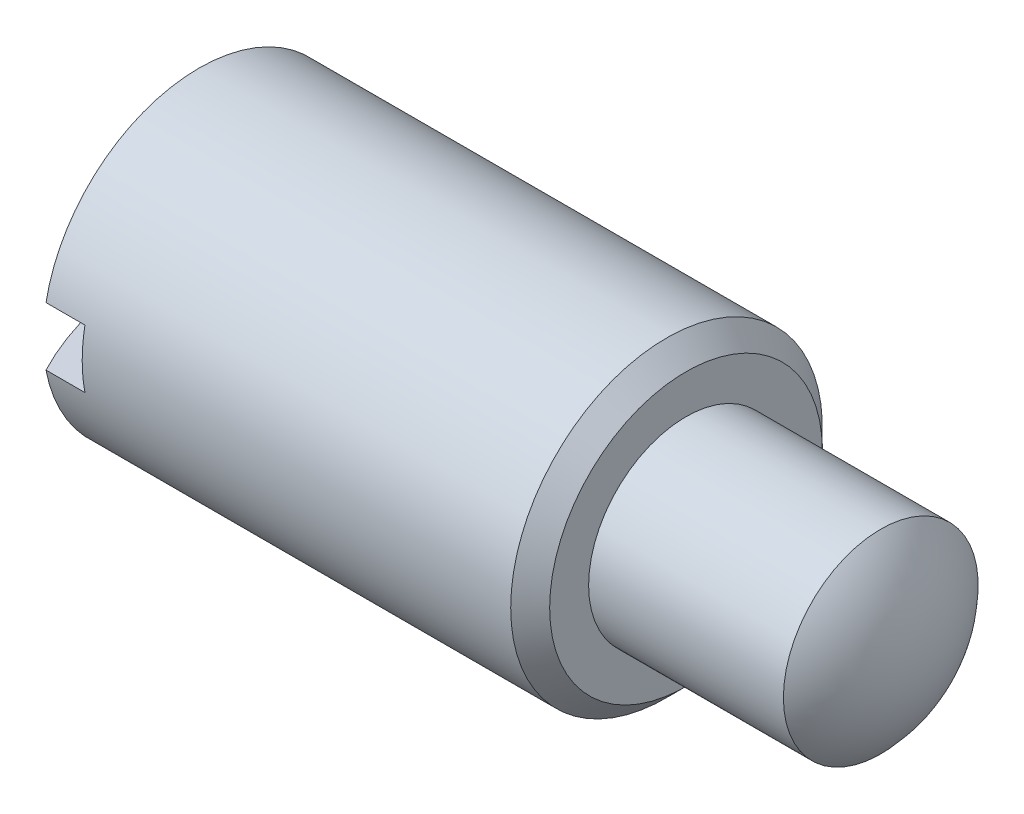
ISO-10303-21;
HEADER;
FILE_DESCRIPTION(('STEP AP214'),'2;1');
FILE_NAME('part.step','',(''),(''),'','','');
FILE_SCHEMA(('AUTOMOTIVE_DESIGN { 1 0 10303 214 1 1 1 1 }'));
ENDSEC;
DATA;
#1=APPLICATION_CONTEXT('core data for automotive mechanical design processes');
#2=APPLICATION_PROTOCOL_DEFINITION('international standard','automotive_design',2000,#1);
#3=PRODUCT_CONTEXT('',#1,'mechanical');
#4=PRODUCT('Part','Part','',(#3));
#5=PRODUCT_RELATED_PRODUCT_CATEGORY('part','',(#4));
#6=PRODUCT_DEFINITION_FORMATION('','',#4);
#7=PRODUCT_DEFINITION_CONTEXT('part definition',#1,'design');
#8=PRODUCT_DEFINITION('design','',#6,#7);
#9=PRODUCT_DEFINITION_SHAPE('','',#8);
#10=(LENGTH_UNIT() NAMED_UNIT(*) SI_UNIT(.MILLI.,.METRE.));
#11=(NAMED_UNIT(*) PLANE_ANGLE_UNIT() SI_UNIT($,.RADIAN.));
#12=(NAMED_UNIT(*) SI_UNIT($,.STERADIAN.) SOLID_ANGLE_UNIT());
#13=UNCERTAINTY_MEASURE_WITH_UNIT(LENGTH_MEASURE(1.E-05),#10,'distance_accuracy_value','');
#14=(GEOMETRIC_REPRESENTATION_CONTEXT(3) GLOBAL_UNCERTAINTY_ASSIGNED_CONTEXT((#13)) GLOBAL_UNIT_ASSIGNED_CONTEXT((#10,
#11,#12)) REPRESENTATION_CONTEXT('',''));
#15=CARTESIAN_POINT('',(0.,0.,0.));
#16=DIRECTION('',(0.,0.,1.));
#17=DIRECTION('',(1.,0.,0.));
#18=AXIS2_PLACEMENT_3D('',#15,#16,#17);
#19=CARTESIAN_POINT('',(7.5,0.,0.));
#20=DIRECTION('',(0.,0.,1.));
#21=DIRECTION('',(1.,0.,0.));
#22=AXIS2_PLACEMENT_3D('',#19,#20,#21);
#23=SPHERICAL_SURFACE('',#22,8.5);
#24=CARTESIAN_POINT('',(0.,0.,0.));
#25=DIRECTION('',(-1.,0.,0.));
#26=DIRECTION('',(0.,0.,1.));
#27=AXIS2_PLACEMENT_3D('',#24,#25,#26);
#28=CIRCLE('',#27,4.);
#29=CARTESIAN_POINT('',(0.,0.75,3.92905841137543));
#30=VERTEX_POINT('',#29);
#31=CARTESIAN_POINT('',(0.,0.75,-3.92905841137543));
#32=VERTEX_POINT('',#31);
#33=EDGE_CURVE('E94',#30,#32,#28,.T.);
#34=ORIENTED_EDGE('',*,*,#33,.T.);
#35=CARTESIAN_POINT('',(7.5,0.75,0.));
#36=DIRECTION('',(0.,-1.,0.));
#37=DIRECTION('',(0.,0.,-1.));
#38=AXIS2_PLACEMENT_3D('',#35,#36,#37);
#39=CIRCLE('',#38,8.46684711093805);
#40=EDGE_CURVE('E111',#32,#30,#39,.F.);
#41=ORIENTED_EDGE('',*,*,#40,.T.);
#42=EDGE_LOOP('',(#34,#41));
#43=FACE_BOUND('',#42,.T.);
#44=ADVANCED_FACE('F32',(#43),#23,.T.);
#45=CARTESIAN_POINT('',(0.,0.,0.));
#46=DIRECTION('',(-1.,0.,0.));
#47=DIRECTION('',(0.,0.,1.));
#48=AXIS2_PLACEMENT_3D('',#45,#46,#47);
#49=CYLINDRICAL_SURFACE('',#48,4.);
#50=CARTESIAN_POINT('',(12.,0.,0.));
#51=DIRECTION('',(-1.,0.,0.));
#52=DIRECTION('',(0.,0.,1.));
#53=AXIS2_PLACEMENT_3D('',#50,#51,#52);
#54=CIRCLE('',#53,4.);
#55=CARTESIAN_POINT('',(12.,0.,4.));
#56=VERTEX_POINT('',#55);
#57=EDGE_CURVE('E99',#56,#56,#54,.T.);
#58=ORIENTED_EDGE('',*,*,#57,.T.);
#59=EDGE_LOOP('',(#58));
#60=FACE_BOUND('',#59,.T.);
#61=DIRECTION('',(-1.,0.,0.));
#62=VECTOR('',#61,1.);
#63=CARTESIAN_POINT('',(0.,0.75,3.92905841137543));
#64=LINE('',#63,#62);
#65=CARTESIAN_POINT('',(1.,0.749999999999999,3.92905841137543));
#66=VERTEX_POINT('',#65);
#67=EDGE_CURVE('E11',#66,#30,#64,.T.);
#68=ORIENTED_EDGE('',*,*,#67,.F.);
#69=CARTESIAN_POINT('',(1.,0.,0.));
#70=DIRECTION('',(1.,0.,0.));
#71=DIRECTION('',(0.,0.,-1.));
#72=AXIS2_PLACEMENT_3D('',#69,#70,#71);
#73=CIRCLE('',#72,4.);
#74=CARTESIAN_POINT('',(1.,-0.75,3.92905841137543));
#75=VERTEX_POINT('',#74);
#76=EDGE_CURVE('E40',#66,#75,#73,.T.);
#77=ORIENTED_EDGE('',*,*,#76,.T.);
#78=DIRECTION('',(-1.,0.,0.));
#79=VECTOR('',#78,1.);
#80=CARTESIAN_POINT('',(0.,-0.75,3.92905841137543));
#81=LINE('',#80,#79);
#82=CARTESIAN_POINT('',(0.,-0.75,3.92905841137543));
#83=VERTEX_POINT('',#82);
#84=EDGE_CURVE('E70',#75,#83,#81,.T.);
#85=ORIENTED_EDGE('',*,*,#84,.T.);
#86=CARTESIAN_POINT('',(0.,-0.75,-3.92905841137543));
#87=VERTEX_POINT('',#86);
#88=EDGE_CURVE('E96',#87,#83,#28,.T.);
#89=ORIENTED_EDGE('',*,*,#88,.F.);
#90=DIRECTION('',(-1.,0.,0.));
#91=VECTOR('',#90,1.);
#92=CARTESIAN_POINT('',(0.,-0.75,-3.92905841137543));
#93=LINE('',#92,#91);
#94=CARTESIAN_POINT('',(1.,-0.75,-3.92905841137543));
#95=VERTEX_POINT('',#94);
#96=EDGE_CURVE('E92',#87,#95,#93,.F.);
#97=ORIENTED_EDGE('',*,*,#96,.T.);
#98=CARTESIAN_POINT('',(1.,0.75,-3.92905841137543));
#99=VERTEX_POINT('',#98);
#100=EDGE_CURVE('E83',#95,#99,#73,.T.);
#101=ORIENTED_EDGE('',*,*,#100,.T.);
#102=DIRECTION('',(-1.,0.,0.));
#103=VECTOR('',#102,1.);
#104=CARTESIAN_POINT('',(0.,0.75,-3.92905841137543));
#105=LINE('',#104,#103);
#106=EDGE_CURVE('E78',#32,#99,#105,.F.);
#107=ORIENTED_EDGE('',*,*,#106,.F.);
#108=ORIENTED_EDGE('',*,*,#33,.F.);
#109=EDGE_LOOP('',(#68,#77,#85,#89,#97,#101,#107,#108));
#110=FACE_BOUND('',#109,.T.);
#111=ADVANCED_FACE('F87',(#60,#110),#49,.T.);
#112=CARTESIAN_POINT('',(7.5,-0.75,0.));
#113=DIRECTION('',(0.,-1.,0.));
#114=DIRECTION('',(0.,0.,-1.));
#115=AXIS2_PLACEMENT_3D('',#112,#113,#114);
#116=CIRCLE('',#115,8.46684711093805);
#117=EDGE_CURVE('E73',#87,#83,#116,.F.);
#118=ORIENTED_EDGE('',*,*,#117,.F.);
#119=ORIENTED_EDGE('',*,*,#88,.T.);
#120=EDGE_LOOP('',(#118,#119));
#121=FACE_BOUND('',#120,.T.);
#122=ADVANCED_FACE('F34',(#121),#23,.T.);
#123=CARTESIAN_POINT('',(12.5,0.,0.));
#124=DIRECTION('',(-1.,0.,0.));
#125=DIRECTION('',(0.,0.,1.));
#126=AXIS2_PLACEMENT_3D('',#123,#124,#125);
#127=CONICAL_SURFACE('',#126,3.5,0.785398163397444);
#128=ORIENTED_EDGE('',*,*,#57,.F.);
#129=EDGE_LOOP('',(#128));
#130=FACE_BOUND('',#129,.T.);
#131=CARTESIAN_POINT('',(12.5,0.,0.));
#132=DIRECTION('',(-1.,0.,0.));
#133=DIRECTION('',(0.,0.,1.));
#134=AXIS2_PLACEMENT_3D('',#131,#132,#133);
#135=CIRCLE('',#134,3.5);
#136=CARTESIAN_POINT('',(12.5,0.,3.5));
#137=VERTEX_POINT('',#136);
#138=EDGE_CURVE('E102',#137,#137,#135,.T.);
#139=ORIENTED_EDGE('',*,*,#138,.T.);
#140=EDGE_LOOP('',(#139));
#141=FACE_BOUND('',#140,.T.);
#142=ADVANCED_FACE('F123',(#130,#141),#127,.T.);
#143=CARTESIAN_POINT('',(12.5,3.5,0.));
#144=DIRECTION('',(-1.,0.,0.));
#145=DIRECTION('',(0.,0.,1.));
#146=AXIS2_PLACEMENT_3D('',#143,#144,#145);
#147=PLANE('',#146);
#148=ORIENTED_EDGE('',*,*,#138,.F.);
#149=EDGE_LOOP('',(#148));
#150=FACE_BOUND('',#149,.T.);
#151=CARTESIAN_POINT('',(12.5,0.,0.));
#152=DIRECTION('',(-1.,0.,0.));
#153=DIRECTION('',(0.,0.,1.));
#154=AXIS2_PLACEMENT_3D('',#151,#152,#153);
#155=CIRCLE('',#154,2.5);
#156=CARTESIAN_POINT('',(12.5,0.,2.5));
#157=VERTEX_POINT('',#156);
#158=EDGE_CURVE('E105',#157,#157,#155,.T.);
#159=ORIENTED_EDGE('',*,*,#158,.T.);
#160=EDGE_LOOP('',(#159));
#161=FACE_BOUND('',#160,.T.);
#162=ADVANCED_FACE('F128',(#150,#161),#147,.F.);
#163=CARTESIAN_POINT('',(0.,0.,0.));
#164=DIRECTION('',(-1.,0.,0.));
#165=DIRECTION('',(0.,0.,1.));
#166=AXIS2_PLACEMENT_3D('',#163,#164,#165);
#167=CYLINDRICAL_SURFACE('',#166,2.5);
#168=ORIENTED_EDGE('',*,*,#158,.F.);
#169=EDGE_LOOP('',(#168));
#170=FACE_BOUND('',#169,.T.);
#171=CARTESIAN_POINT('',(17.5,0.,0.));
#172=DIRECTION('',(-1.,0.,0.));
#173=DIRECTION('',(0.,0.,1.));
#174=AXIS2_PLACEMENT_3D('',#171,#172,#173);
#175=CIRCLE('',#174,2.5);
#176=CARTESIAN_POINT('',(17.5,0.,2.5));
#177=VERTEX_POINT('',#176);
#178=EDGE_CURVE('E108',#177,#177,#175,.T.);
#179=ORIENTED_EDGE('',*,*,#178,.T.);
#180=EDGE_LOOP('',(#179));
#181=FACE_BOUND('',#180,.T.);
#182=ADVANCED_FACE('F134',(#170,#181),#167,.T.);
#183=CARTESIAN_POINT('',(14.875,0.,0.));
#184=DIRECTION('',(0.,0.,1.));
#185=DIRECTION('',(1.,0.,0.));
#186=AXIS2_PLACEMENT_3D('',#183,#184,#185);
#187=SPHERICAL_SURFACE('',#186,3.625);
#188=CARTESIAN_POINT('',(14.875,0.,0.));
#189=DIRECTION('',(-1.,0.,0.));
#190=DIRECTION('',(0.,0.,1.));
#191=AXIS2_PLACEMENT_3D('',#188,#189,#190);
#192=SPHERICAL_SURFACE('',#191,3.625);
#193=ORIENTED_EDGE('',*,*,#178,.F.);
#194=EDGE_LOOP('',(#193));
#195=FACE_BOUND('',#194,.T.);
#196=ADVANCED_FACE('F140',(#195),#192,.T.);
#197=CARTESIAN_POINT('',(1.,0.749999999999998,28.1805007939887));
#198=DIRECTION('',(0.,-1.,0.));
#199=DIRECTION('',(0.,0.,-1.));
#200=AXIS2_PLACEMENT_3D('',#197,#198,#199);
#201=PLANE('',#200);
#202=DIRECTION('',(0.,0.,-1.));
#203=VECTOR('',#202,1.);
#204=CARTESIAN_POINT('',(1.,0.749999999999998,28.1805007939887));
#205=LINE('',#204,#203);
#206=EDGE_CURVE('E85',#66,#99,#205,.T.);
#207=ORIENTED_EDGE('',*,*,#206,.F.);
#208=ORIENTED_EDGE('',*,*,#67,.T.);
#209=ORIENTED_EDGE('',*,*,#40,.F.);
#210=ORIENTED_EDGE('',*,*,#106,.T.);
#211=EDGE_LOOP('',(#207,#208,#209,#210));
#212=FACE_BOUND('',#211,.T.);
#213=ADVANCED_FACE('F114',(#212),#201,.T.);
#214=CARTESIAN_POINT('',(1.,0.749999999999998,28.1805007939887));
#215=DIRECTION('',(1.,0.,0.));
#216=DIRECTION('',(0.,0.,-1.));
#217=AXIS2_PLACEMENT_3D('',#214,#215,#216);
#218=PLANE('',#217);
#219=ORIENTED_EDGE('',*,*,#76,.F.);
#220=ORIENTED_EDGE('',*,*,#206,.T.);
#221=ORIENTED_EDGE('',*,*,#100,.F.);
#222=DIRECTION('',(0.,0.,-1.));
#223=VECTOR('',#222,1.);
#224=CARTESIAN_POINT('',(1.,-0.750000000000002,28.1805007939887));
#225=LINE('',#224,#223);
#226=EDGE_CURVE('E47',#75,#95,#225,.T.);
#227=ORIENTED_EDGE('',*,*,#226,.F.);
#228=EDGE_LOOP('',(#219,#220,#221,#227));
#229=FACE_BOUND('',#228,.T.);
#230=ADVANCED_FACE('F80',(#229),#218,.F.);
#231=CARTESIAN_POINT('',(1.,-0.750000000000002,28.1805007939887));
#232=DIRECTION('',(0.,-1.,0.));
#233=DIRECTION('',(0.,0.,-1.));
#234=AXIS2_PLACEMENT_3D('',#231,#232,#233);
#235=PLANE('',#234);
#236=ORIENTED_EDGE('',*,*,#84,.F.);
#237=ORIENTED_EDGE('',*,*,#226,.T.);
#238=ORIENTED_EDGE('',*,*,#96,.F.);
#239=ORIENTED_EDGE('',*,*,#117,.T.);
#240=EDGE_LOOP('',(#236,#237,#238,#239));
#241=FACE_BOUND('',#240,.T.);
#242=ADVANCED_FACE('F71',(#241),#235,.F.);
#243=CLOSED_SHELL('',(#44,#111,#122,#142,#162,#182,#196,#213,#230,#242));
#244=MANIFOLD_SOLID_BREP('B2',#243);
#245=ADVANCED_BREP_SHAPE_REPRESENTATION('',(#18,#244),#14);
#246=SHAPE_DEFINITION_REPRESENTATION(#9,#245);
ENDSEC;
END-ISO-10303-21;
